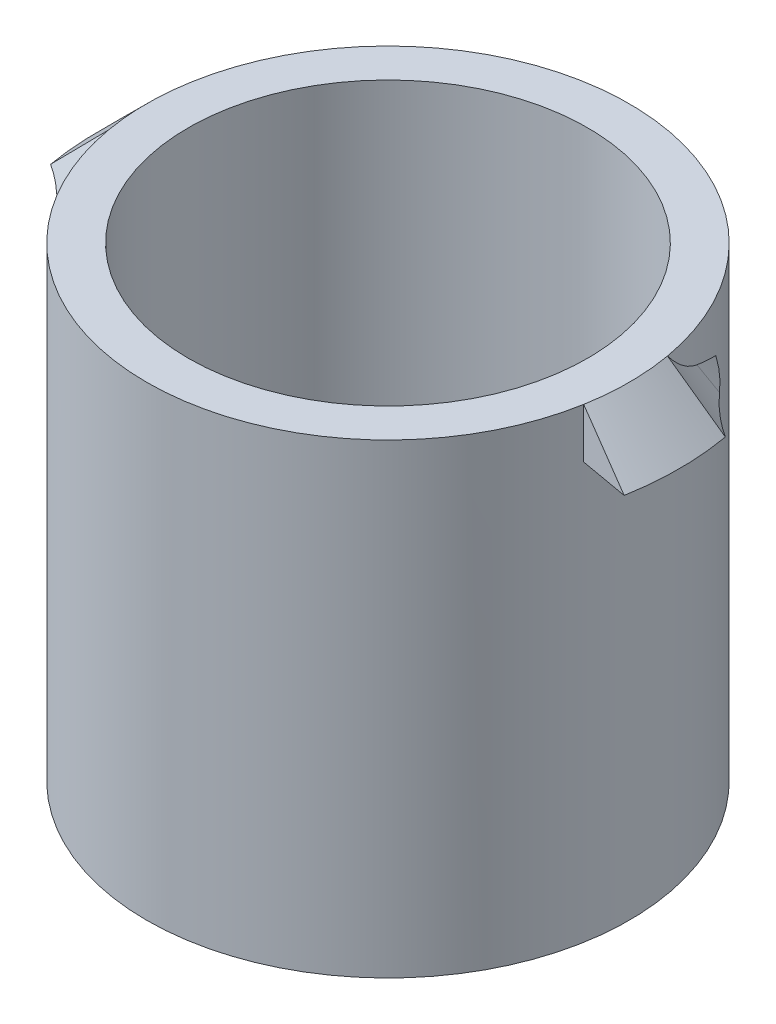
ISO-10303-21;
HEADER;
FILE_DESCRIPTION(('STEP AP214'),'2;1');
FILE_NAME('part.step','',(''),(''),'','','');
FILE_SCHEMA(('AUTOMOTIVE_DESIGN { 1 0 10303 214 1 1 1 1 }'));
ENDSEC;
DATA;
#1=APPLICATION_CONTEXT('core data for automotive mechanical design processes');
#2=APPLICATION_PROTOCOL_DEFINITION('international standard','automotive_design',2000,#1);
#3=PRODUCT_CONTEXT('',#1,'mechanical');
#4=PRODUCT('Part','Part','',(#3));
#5=PRODUCT_RELATED_PRODUCT_CATEGORY('part','',(#4));
#6=PRODUCT_DEFINITION_FORMATION('','',#4);
#7=PRODUCT_DEFINITION_CONTEXT('part definition',#1,'design');
#8=PRODUCT_DEFINITION('design','',#6,#7);
#9=PRODUCT_DEFINITION_SHAPE('','',#8);
#10=(LENGTH_UNIT() NAMED_UNIT(*) SI_UNIT(.MILLI.,.METRE.));
#11=(NAMED_UNIT(*) PLANE_ANGLE_UNIT() SI_UNIT($,.RADIAN.));
#12=(NAMED_UNIT(*) SI_UNIT($,.STERADIAN.) SOLID_ANGLE_UNIT());
#13=UNCERTAINTY_MEASURE_WITH_UNIT(LENGTH_MEASURE(1.E-05),#10,'distance_accuracy_value','');
#14=(GEOMETRIC_REPRESENTATION_CONTEXT(3) GLOBAL_UNCERTAINTY_ASSIGNED_CONTEXT((#13)) GLOBAL_UNIT_ASSIGNED_CONTEXT((#10,
#11,#12)) REPRESENTATION_CONTEXT('',''));
#15=CARTESIAN_POINT('',(0.,0.,0.));
#16=DIRECTION('',(0.,0.,1.));
#17=DIRECTION('',(1.,0.,0.));
#18=AXIS2_PLACEMENT_3D('',#15,#16,#17);
#19=CARTESIAN_POINT('',(0.,15.9574468085106,0.));
#20=DIRECTION('',(0.,1.,0.));
#21=DIRECTION('',(0.,0.,1.));
#22=AXIS2_PLACEMENT_3D('',#19,#20,#21);
#23=CYLINDRICAL_SURFACE('',#22,14.5);
#24=CARTESIAN_POINT('',(0.,12.5,0.));
#25=DIRECTION('',(0.,1.,0.));
#26=DIRECTION('',(0.,0.,1.));
#27=AXIS2_PLACEMENT_3D('',#24,#25,#26);
#28=CIRCLE('',#27,14.5);
#29=CARTESIAN_POINT('',(14.279712418677,12.5,-2.5178985761705));
#30=VERTEX_POINT('',#29);
#31=CARTESIAN_POINT('',(-14.279712418677,12.5,-2.5178985761705));
#32=VERTEX_POINT('',#31);
#33=EDGE_CURVE('E431',#30,#32,#28,.T.);
#34=ORIENTED_EDGE('',*,*,#33,.F.);
#35=CARTESIAN_POINT('',(18.1291565500211,8.59117198806576,-3.19665943725633));
#36=CARTESIAN_POINT('',(17.4407569855747,7.82584616983761,-4.3201406217331));
#37=CARTESIAN_POINT('',(16.9940332672841,7.35568776884984,-5.69898671094949));
#38=CARTESIAN_POINT('',(17.8477187224725,8.87695144774998,-3.14703435486752));
#39=CARTESIAN_POINT('',(17.1640434128771,8.10212081380435,-4.26337786019868));
#40=CARTESIAN_POINT('',(16.7196577880142,7.6209236133436,-5.63631734597751));
#41=CARTESIAN_POINT('',(17.5665902636226,9.16241676622455,-3.0974638225273));
#42=CARTESIAN_POINT('',(16.8878124566996,8.37723706924647,-4.20653752389778));
#43=CARTESIAN_POINT('',(16.4460136334214,7.88422804667438,-5.5736622971427));
#44=CARTESIAN_POINT('',(17.005404249799,9.73225997887913,-2.99851158709397));
#45=CARTESIAN_POINT('',(16.3368952675705,8.92414111391598,-4.09281642024974));
#46=CARTESIAN_POINT('',(15.90084427862,8.40565910452887,-5.44872084785809));
#47=CARTESIAN_POINT('',(16.7253462948507,10.016638279204,-2.94912981347454));
#48=CARTESIAN_POINT('',(16.0621983883405,9.19594031149953,-4.0359336233473));
#49=CARTESIAN_POINT('',(15.6293182372057,8.66378785601487,-5.38643430370933));
#50=CARTESIAN_POINT('',(16.3387183593955,10.4092305737636,-2.88095687695818));
#51=CARTESIAN_POINT('',(15.6833677163959,9.56922832823252,-3.95723475561948));
#52=CARTESIAN_POINT('',(15.2553661520049,9.01662550680332,-5.30070157746985));
#53=CARTESIAN_POINT('',(16.2315999430798,10.5180014643137,-2.86206901003095));
#54=CARTESIAN_POINT('',(15.5784506954577,9.67244521230164,-3.9354121663281));
#55=CARTESIAN_POINT('',(15.1518553783773,9.11400703391215,-5.27697588824107));
#56=CARTESIAN_POINT('',(16.0175590564884,10.7353442765902,-2.82432782675013));
#57=CARTESIAN_POINT('',(15.3688968891475,9.87823810345469,-3.89177208357924));
#58=CARTESIAN_POINT('',(14.9452278276463,9.3077754630276,-5.22964458391971));
#59=CARTESIAN_POINT('',(15.910636620466,10.8439161635349,-2.80547451643631));
#60=CARTESIAN_POINT('',(15.264259270196,9.98081486825436,-3.86995440765565));
#61=CARTESIAN_POINT('',(14.8421111165284,9.40416220268989,-5.20603898873491));
#62=CARTESIAN_POINT('',(15.8038326794683,10.9523677274782,-2.78664209999243));
#63=CARTESIAN_POINT('',(15.1597847322079,10.0830312774162,-3.84814445438687));
#64=CARTESIAN_POINT('',(14.7392177991944,9.49999999395313,-5.18250904006833));
#65=CARTESIAN_POINT('',(15.6314897905654,11.1273692832396,-2.75625339874559));
#66=CARTESIAN_POINT('',(14.9911975400007,10.2479705980724,-3.81295103101248));
#67=CARTESIAN_POINT('',(14.573184600078,9.65464226771677,-5.14454412769313));
#68=CARTESIAN_POINT('',(15.4594540896592,11.3020589121342,-2.72591886303073));
#69=CARTESIAN_POINT('',(14.8230297814695,10.4119843450707,-3.77777558983734));
#70=CARTESIAN_POINT('',(14.4077324469624,9.80786691989288,-5.10676866487617));
#71=CARTESIAN_POINT('',(15.116240053358,11.6505675781671,-2.66540096827298));
#72=CARTESIAN_POINT('',(14.4877897004126,10.7377178792464,-3.70752397279333));
#73=CARTESIAN_POINT('',(14.0782686435995,10.1109285332955,-5.03178743055511));
#74=CARTESIAN_POINT('',(14.9450612560556,11.8243870843386,-2.63521752778334));
#75=CARTESIAN_POINT('',(14.3207116154969,10.8994439572249,-3.67244666268691));
#76=CARTESIAN_POINT('',(13.9142561706036,10.260767518492,-4.99458132322486));
#77=CARTESIAN_POINT('',(14.5390117786154,12.2367005294736,-2.56362004940808));
#78=CARTESIAN_POINT('',(13.9247002715405,11.2810744096598,-3.58916182861151));
#79=CARTESIAN_POINT('',(13.5259946396655,10.6126638420458,-4.90694430149904));
#80=CARTESIAN_POINT('',(14.3045405957042,12.474788808322,-2.52227645366219));
#81=CARTESIAN_POINT('',(13.6962694527892,11.49985081723,-3.54100529869052));
#82=CARTESIAN_POINT('',(13.3024267410814,10.8130349641296,-4.85683426769212));
#83=CARTESIAN_POINT('',(13.8375676610241,12.9489655532265,-2.43993652601749));
#84=CARTESIAN_POINT('',(13.2418162087176,11.9316685298048,-3.44501338978302));
#85=CARTESIAN_POINT('',(12.8584361890877,11.2053501817832,-4.75856535871571));
#86=CARTESIAN_POINT('',(13.6050677497857,13.185052150359,-2.39894051865384));
#87=CARTESIAN_POINT('',(13.0157742255461,12.1447247878936,-3.39717368211567));
#88=CARTESIAN_POINT('',(12.6380163663595,11.3972869803191,-4.71040817574885));
#89=CARTESIAN_POINT('',(13.373894220335,13.4197919041269,-2.35817838818606));
#90=CARTESIAN_POINT('',(12.7912758197526,12.3542360568956,-3.34958871125807));
#91=CARTESIAN_POINT('',(12.4194951799688,11.5841818455645,-4.663568756941));
#92=(BOUNDED_SURFACE() B_SPLINE_SURFACE(3,2,((#35,#36,#37),(#38,#39,#40),(#41,#42,#43),(#44,#45,
#46),(#47,#48,#49),(#50,#51,#52),(#53,#54,#55),(#56,#57,#58),(#59,#60,#61),(#62,#63,#64),(#65,
#66,#67),(#68,#69,#70),(#71,#72,#73),(#74,#75,#76),(#77,#78,#79),(#80,#81,#82),(#83,#84,#85),
(#86,#87,#88),(#89,#90,#91)),.UNSPECIFIED.,.F.,.F.,.F.) B_SPLINE_SURFACE_WITH_KNOTS((4,2,2,2,3,
2,2,2,4),(3,3),(0.,1.22308796174281,2.44566254004529,2.91477154809211,3.38395593886468,
4.14105476039857,4.8976883226624,5.94051711722712,6.98423104275938),(0.,1.),
.UNSPECIFIED.) GEOMETRIC_REPRESENTATION_ITEM() RATIONAL_B_SPLINE_SURFACE(((1.,0.988589186786387,
1.),(1.,0.988627638307937,1.),(1.,0.988660409305402,1.),(1.,0.988708009242246,1.),(1.,
0.988722845706918,1.),(1.,0.988726438614572,1.),(1.,0.988725632858965,1.),(1.,0.988719855325513,
1.),(1.,0.988714882878236,1.),(1.,0.988707546147952,1.),(1.,0.988695622018106,1.),(1.,
0.988677700783008,1.),(1.,0.988626524691875,1.),(1.,0.988593279265565,1.),(1.,0.98849200121005,
1.),(1.,0.988415566864297,1.),(1.,0.988214128703858,1.),(1.,0.988089083719501,1.),(1.,
0.987933238422901,1.))) REPRESENTATION_ITEM('') SURFACE());
#93=CARTESIAN_POINT('',(14.279712418677,12.5,-2.5178985761705));
#94=CARTESIAN_POINT('',(14.2577653690716,12.340531563629,-2.64226033705779));
#95=CARTESIAN_POINT('',(14.2331889683553,12.1856097889129,-2.77223897064588));
#96=CARTESIAN_POINT('',(14.1776524967388,11.8865293051149,-3.04360905639239));
#97=CARTESIAN_POINT('',(14.1466740368025,11.742403267087,-3.18503265447744));
#98=CARTESIAN_POINT('',(14.0782333561083,11.4711416042713,-3.47489384314671));
#99=CARTESIAN_POINT('',(14.0409624534521,11.3436595565626,-3.62305027029018));
#100=CARTESIAN_POINT('',(13.9584976606385,11.1038120470079,-3.92878615841227));
#101=CARTESIAN_POINT('',(13.9133161642593,10.9914234175035,-4.08635062872344));
#102=CARTESIAN_POINT('',(13.8300725424804,10.8171087432795,-4.3580159932998));
#103=CARTESIAN_POINT('',(13.7943629854591,10.7505473880125,-4.46987962041777));
#104=CARTESIAN_POINT('',(13.7183895920387,10.6254368549581,-4.69791441534058));
#105=CARTESIAN_POINT('',(13.678087851805,10.5669647260218,-4.81411517711495));
#106=CARTESIAN_POINT('',(13.6355514508136,10.5131646992949,-4.93170727357322));
#107=B_SPLINE_CURVE_WITH_KNOTS('',3,(#93,#94,#95,#96,#97,#98,#99,#100,#101,#102,#103,#104,#105,
#106),.UNSPECIFIED.,.F.,.F.,(4,2,2,2,2,2,4),(0.,0.610335053411883,1.22244820350455,
1.81851049656598,2.41364714282786,2.81822592662251,3.22642604798356),.UNSPECIFIED.);
#108=CARTESIAN_POINT('',(13.6355514508136,10.5131646992949,-4.93170727357322));
#109=VERTEX_POINT('',#108);
#110=EDGE_CURVE('E60',#30,#109,#107,.T.);
#111=ORIENTED_EDGE('',*,*,#110,.T.);
#112=CARTESIAN_POINT('',(12.7018678108422,9.5,-6.99375107620292));
#113=CARTESIAN_POINT('',(12.7798918434986,9.57437639739467,-6.85204294006238));
#114=CARTESIAN_POINT('',(12.8555950901162,9.64851251113147,-6.70894262610205));
#115=CARTESIAN_POINT('',(13.00229253388,9.79614059879349,-6.4200195425192));
#116=CARTESIAN_POINT('',(13.0732866740729,9.86963256491889,-6.27419673999743));
#117=CARTESIAN_POINT('',(13.279192429628,10.0889910883362,-5.83254754179518));
#118=CARTESIAN_POINT('',(13.4069237440701,10.2336412198049,-5.53272840954804));
#119=CARTESIAN_POINT('',(13.6425088350883,10.5185385064637,-4.92328407863446));
#120=CARTESIAN_POINT('',(13.7503606275717,10.6587852210093,-4.61365790477787));
#121=CARTESIAN_POINT('',(13.8966727631589,10.8642117380643,-4.14240509184159));
#122=CARTESIAN_POINT('',(13.9428589080589,10.9318514990133,-3.98421453506626));
#123=CARTESIAN_POINT('',(14.0300022012646,11.0651828181942,-3.66555940662737));
#124=CARTESIAN_POINT('',(14.0709586704734,11.1308741225616,-3.50509454263437));
#125=CARTESIAN_POINT('',(14.1726137213676,11.3022272185183,-3.0761252625409));
#126=CARTESIAN_POINT('',(14.2286714538574,11.4058856741731,-2.80570013661054));
#127=CARTESIAN_POINT('',(14.3256094209771,11.6051459311406,-2.25918325012001));
#128=CARTESIAN_POINT('',(14.3664896918479,11.7007477516907,-1.98309150309233));
#129=CARTESIAN_POINT('',(14.4160175900219,11.8370839050823,-1.56469417320338));
#130=CARTESIAN_POINT('',(14.4305783533859,11.8814314251823,-1.42423909427642));
#131=CARTESIAN_POINT('',(14.455638152361,11.9675553940351,-1.14217786005569));
#132=CARTESIAN_POINT('',(14.4661372186287,12.0093318621915,-1.00057171345812));
#133=CARTESIAN_POINT('',(14.482997589122,12.0902239002845,-0.716284099925345));
#134=CARTESIAN_POINT('',(14.4893569282564,12.129338198636,-0.573602154778654));
#135=CARTESIAN_POINT('',(14.4978590369467,12.2048617261975,-0.28739179971808));
#136=CARTESIAN_POINT('',(14.5000015953816,12.2412708198785,-0.143863347783051));
#137=CARTESIAN_POINT('',(14.5,12.2763141276567,0.));
#138=B_SPLINE_CURVE_WITH_KNOTS('',3,(#112,#113,#114,#115,#116,#117,#118,#119,#120,#121,#122,
#123,#124,#125,#126,#127,#128,#129,#130,#131,#132,#133,#134,#135,#136,#137),.UNSPECIFIED.,.F.,
.F.,(4,2,2,2,2,2,2,2,2,2,2,2,4),(0.,0.534101285880762,1.06820903016045,2.13713267175302,
3.20616294048145,3.74048430498869,4.27487498313207,5.15930075306908,6.04372441114665,
6.48767905723223,6.93163035239745,7.37579223387566,7.81997635259694),.UNSPECIFIED.);
#139=CARTESIAN_POINT('',(12.701230867694,9.5,-6.99490763979816));
#140=VERTEX_POINT('',#139);
#141=EDGE_CURVE('E107',#140,#109,#138,.T.);
#142=ORIENTED_EDGE('',*,*,#141,.F.);
#143=CARTESIAN_POINT('',(0.,9.5,0.));
#144=DIRECTION('',(0.,-1.,0.));
#145=DIRECTION('',(0.,0.,1.));
#146=AXIS2_PLACEMENT_3D('',#143,#144,#145);
#147=CIRCLE('',#146,14.5);
#148=CARTESIAN_POINT('',(14.279712418677,9.5,2.5178985761705));
#149=VERTEX_POINT('',#148);
#150=EDGE_CURVE('E101',#140,#149,#147,.T.);
#151=ORIENTED_EDGE('',*,*,#150,.T.);
#152=DIRECTION('',(0.,1.,0.));
#153=VECTOR('',#152,1.);
#154=CARTESIAN_POINT('',(14.279712418677,0.,2.5178985761705));
#155=LINE('',#154,#153);
#156=CARTESIAN_POINT('',(14.279712418677,12.5,2.5178985761705));
#157=VERTEX_POINT('',#156);
#158=EDGE_CURVE('E105',#149,#157,#155,.T.);
#159=ORIENTED_EDGE('',*,*,#158,.T.);
#160=CARTESIAN_POINT('',(-14.279712418677,12.5,2.5178985761705));
#161=VERTEX_POINT('',#160);
#162=EDGE_CURVE('E433',#161,#157,#28,.T.);
#163=ORIENTED_EDGE('',*,*,#162,.F.);
#164=CARTESIAN_POINT('',(-18.1291497187687,8.5911789247013,3.19665823272221));
#165=CARTESIAN_POINT('',(-17.4407502686279,7.82585287661343,4.32013924382053));
#166=CARTESIAN_POINT('',(-16.9940266073607,7.35569420763594,5.69898518937925));
#167=CARTESIAN_POINT('',(-17.8477113180827,8.87695896636438,3.14703304927383));
#168=CARTESIAN_POINT('',(-17.1640361356874,8.10212806818236,4.26337636462024));
#169=CARTESIAN_POINT('',(-16.7196505764197,7.62093056442041,5.63631569664085));
#170=CARTESIAN_POINT('',(-17.5665822878936,9.16242486499207,3.09746241619108));
#171=CARTESIAN_POINT('',(-16.8878046220464,8.37724486472027,4.20653591035197));
#172=CARTESIAN_POINT('',(-16.4460058744271,7.88423549931669,5.57366052042005));
#173=CARTESIAN_POINT('',(-17.0053951386971,9.73226923053445,2.99850998056088));
#174=CARTESIAN_POINT('',(-16.3368863280721,8.9241499700652,4.09281457129179));
#175=CARTESIAN_POINT('',(-15.9008354385061,8.40566752772569,5.44871882069888));
#176=CARTESIAN_POINT('',(-16.7253366197118,10.0166481035975,2.94912810748651));
#177=CARTESIAN_POINT('',(-16.0621889013603,9.19594968733291,4.03593165692461));
#178=CARTESIAN_POINT('',(-15.6293088633653,8.66379674821708,5.38643215349757));
#179=CARTESIAN_POINT('',(-16.3387098362393,10.4092392284032,2.88095537409579));
#180=CARTESIAN_POINT('',(-15.6833593677602,9.56923654418665,3.95723301955705));
#181=CARTESIAN_POINT('',(-15.255357914377,9.01663326114808,5.30069968927733));
#182=CARTESIAN_POINT('',(-16.2315931281887,10.5180083843354,2.86206780838179));
#183=CARTESIAN_POINT('',(-15.5784440220504,9.67245177172701,3.93541077744913));
#184=CARTESIAN_POINT('',(-15.1518487962716,9.11401321628149,5.27697438009305));
#185=CARTESIAN_POINT('',(-16.0175556523153,10.7353477332781,2.82432722650256));
#186=CARTESIAN_POINT('',(-15.368893557729,9.87824136928026,3.89177138892986));
#187=CARTESIAN_POINT('',(-14.945224544633,9.30777853181516,5.22964383231606));
#188=CARTESIAN_POINT('',(-15.9106349187442,10.8439178915086,2.80547421637684));
#189=CARTESIAN_POINT('',(-15.2642576055763,9.98081649697402,3.86995406006077));
#190=CARTESIAN_POINT('',(-14.8421094770822,9.40416372987877,5.20603861363022));
#191=CARTESIAN_POINT('',(-15.8038326764726,10.9523677305202,2.7866420994642));
#192=CARTESIAN_POINT('',(-15.1597847292191,10.0830312804595,3.84814445352863));
#193=CARTESIAN_POINT('',(-14.7392177962169,9.4999999970197,5.18250903895706));
#194=CARTESIAN_POINT('',(-15.6314875076459,11.1273716013767,2.7562529962053));
#195=CARTESIAN_POINT('',(-14.9911953067799,10.2479727827704,3.81295056476283));
#196=CARTESIAN_POINT('',(-14.5731824006293,9.6546443160147,5.14454362486267));
#197=CARTESIAN_POINT('',(-15.459449534655,11.3020635374066,2.72591805986061));
#198=CARTESIAN_POINT('',(-14.8230253287952,10.4119886876362,3.77777465847189));
#199=CARTESIAN_POINT('',(-14.4077280662409,9.80787097669929,5.10676766477309));
#200=CARTESIAN_POINT('',(-15.1162309796572,11.6505767918444,2.66539936833471));
#201=CARTESIAN_POINT('',(-14.4877808407312,10.7377264714852,3.70752211448296));
#202=CARTESIAN_POINT('',(-14.0782599416379,10.1109365107056,5.0317854532753));
#203=CARTESIAN_POINT('',(-14.9450499357192,11.8243985793093,2.63521553170262));
#204=CARTESIAN_POINT('',(-14.3207005680128,10.8994546415459,3.67244434249869));
#205=CARTESIAN_POINT('',(-13.9142453286335,10.260777408099,4.99457886602343));
#206=CARTESIAN_POINT('',(-14.5389982583595,12.2367142583013,2.56361766542217));
#207=CARTESIAN_POINT('',(-13.9246870950308,11.2810870550038,3.58915905308382));
#208=CARTESIAN_POINT('',(-13.5259817355866,10.6126754501035,4.90694140291718));
#209=CARTESIAN_POINT('',(-14.3045271123684,12.4748024996599,2.52227407618631));
#210=CARTESIAN_POINT('',(-13.6962563217759,11.4998633605593,3.54100252867456));
#211=CARTESIAN_POINT('',(-13.3024138971274,10.8130464219053,4.85683140061454));
#212=CARTESIAN_POINT('',(-13.8375542592976,12.9489791616963,2.43993416293151));
#213=CARTESIAN_POINT('',(-13.2418031752644,11.9316808485006,3.4450106331212));
#214=CARTESIAN_POINT('',(-12.8584234719508,11.2053613112803,4.75856256739329));
#215=CARTESIAN_POINT('',(-13.6050543927722,13.1850657134261,2.39893816345196));
#216=CARTESIAN_POINT('',(-13.0157612440697,12.1447369839996,3.39717093327682));
#217=CARTESIAN_POINT('',(-12.6380037159464,11.3972979317317,4.71040542870312));
#218=CARTESIAN_POINT('',(-13.3738809134153,13.4198054163273,2.35817604181709));
#219=CARTESIAN_POINT('',(-12.7912628945763,12.3542481176025,3.34958597176665));
#220=CARTESIAN_POINT('',(-12.4194825997311,11.5841926026136,4.6635660622337));
#221=(BOUNDED_SURFACE() B_SPLINE_SURFACE(3,2,((#164,#165,#166),(#167,#168,#169),(#170,#171,
#172),(#173,#174,#175),(#176,#177,#178),(#179,#180,#181),(#182,#183,#184),(#185,#186,#187),
(#188,#189,#190),(#191,#192,#193),(#194,#195,#196),(#197,#198,#199),(#200,#201,#202),(#203,#204,
#205),(#206,#207,#208),(#209,#210,#211),(#212,#213,#214),(#215,#216,#217),(#218,#219,#220)),
.UNSPECIFIED.,.F.,.F.,.F.) B_SPLINE_SURFACE_WITH_KNOTS((4,2,2,2,3,2,2,2,4),(3,3),(0.,
1.22309047794446,2.4456675707035,2.91476911909797,3.38394604776447,4.14105488539585,
4.89769844740241,5.94052724135779,6.98424117396869),(0.,1.),
.UNSPECIFIED.) GEOMETRIC_REPRESENTATION_ITEM() RATIONAL_B_SPLINE_SURFACE(((1.,0.988589187728949,
1.),(1.,0.988627639221839,1.),(1.,0.988660410156714,1.),(1.,0.988708009833657,1.),(1.,
0.988722846101084,1.),(1.,0.988726438578556,1.),(1.,0.988725632740626,1.),(1.,0.988719855167744,
1.),(1.,0.988714882763393,1.),(1.,0.988707546151393,1.),(1.,0.988695621856175,1.),(1.,
0.988677700306075,1.),(1.,0.988626523135708,1.),(1.,0.988593276945648,1.),(1.,0.988491997136989,
1.),(1.,0.988415562001316,1.),(1.,0.988214121989115,1.),(1.,0.98808907594233,1.),(1.,
0.987933229412204,1.))) REPRESENTATION_ITEM('') SURFACE());
#222=CARTESIAN_POINT('',(-14.279712418677,12.5,2.5178985761705));
#223=CARTESIAN_POINT('',(-14.2577653690717,12.3405315635698,2.64226033706174));
#224=CARTESIAN_POINT('',(-14.2331889683563,12.1856097887964,2.77223897064293));
#225=CARTESIAN_POINT('',(-14.1776524967528,11.8865293049158,3.04360905632256));
#226=CARTESIAN_POINT('',(-14.1466740368308,11.7424032668591,3.18503265434409));
#227=CARTESIAN_POINT('',(-14.0782333561717,11.4711416039356,3.47489384289115));
#228=CARTESIAN_POINT('',(-14.0409624535359,11.3436595561498,3.62305026997665));
#229=CARTESIAN_POINT('',(-13.9584976606884,11.1038120467944,3.92878615823006));
#230=CARTESIAN_POINT('',(-13.913316164254,10.9914234175678,4.08635062873146));
#231=CARTESIAN_POINT('',(-13.8300725424856,10.8171087432393,4.358015993289));
#232=CARTESIAN_POINT('',(-13.7943629854977,10.7505473877736,4.46987962030436));
#233=CARTESIAN_POINT('',(-13.7183895921087,10.6254368545372,4.69791441512818));
#234=CARTESIAN_POINT('',(-13.6780878518726,10.5669647256194,4.81411517690712));
#235=CARTESIAN_POINT('',(-13.6355514508136,10.5131646992949,4.93170727357322));
#236=B_SPLINE_CURVE_WITH_KNOTS('',3,(#222,#223,#224,#225,#226,#227,#228,#229,#230,#231,#232,
#233,#234,#235),.UNSPECIFIED.,.F.,.F.,(4,2,2,2,2,2,4),(0.,0.610335053539954,1.22244820356657,
1.81851049659689,2.41364714290705,2.81822592671485,3.22642604808947),.UNSPECIFIED.);
#237=CARTESIAN_POINT('',(-13.6355514508136,10.5131646992949,4.93170727357322));
#238=VERTEX_POINT('',#237);
#239=EDGE_CURVE('E288',#161,#238,#236,.T.);
#240=ORIENTED_EDGE('',*,*,#239,.T.);
#241=CARTESIAN_POINT('',(-12.7018678108422,9.5,6.99375107620292));
#242=CARTESIAN_POINT('',(-12.7798918434986,9.57437639739467,6.85204294006238));
#243=CARTESIAN_POINT('',(-12.8555950901162,9.64851251113147,6.70894262610205));
#244=CARTESIAN_POINT('',(-13.00229253388,9.79614059879349,6.4200195425192));
#245=CARTESIAN_POINT('',(-13.0732866740729,9.86963256491889,6.27419673999743));
#246=CARTESIAN_POINT('',(-13.279192429628,10.0889910883362,5.83254754179518));
#247=CARTESIAN_POINT('',(-13.4069237440701,10.2336412198049,5.53272840954804));
#248=CARTESIAN_POINT('',(-13.6425088350883,10.5185385064637,4.92328407863446));
#249=CARTESIAN_POINT('',(-13.7503606275717,10.6587852210093,4.61365790477787));
#250=CARTESIAN_POINT('',(-13.8966727631589,10.8642117380643,4.14240509184159));
#251=CARTESIAN_POINT('',(-13.9428589080589,10.9318514990133,3.98421453506626));
#252=CARTESIAN_POINT('',(-14.0300022012646,11.0651828181942,3.66555940662737));
#253=CARTESIAN_POINT('',(-14.0709586704734,11.1308741225616,3.50509454263437));
#254=CARTESIAN_POINT('',(-14.1726137213676,11.3022272185183,3.0761252625409));
#255=CARTESIAN_POINT('',(-14.2286714538574,11.4058856741731,2.80570013661054));
#256=CARTESIAN_POINT('',(-14.3256094209771,11.6051459311406,2.25918325012001));
#257=CARTESIAN_POINT('',(-14.3664896918479,11.7007477516907,1.98309150309233));
#258=CARTESIAN_POINT('',(-14.4160175900219,11.8370839050823,1.56469417320338));
#259=CARTESIAN_POINT('',(-14.4305783533859,11.8814314251823,1.42423909427642));
#260=CARTESIAN_POINT('',(-14.455638152361,11.9675553940351,1.14217786005569));
#261=CARTESIAN_POINT('',(-14.4661372186287,12.0093318621915,1.00057171345812));
#262=CARTESIAN_POINT('',(-14.482997589122,12.0902239002845,0.716284099925345));
#263=CARTESIAN_POINT('',(-14.4893569282564,12.129338198636,0.573602154778654));
#264=CARTESIAN_POINT('',(-14.4978590369467,12.2048617261975,0.28739179971808));
#265=CARTESIAN_POINT('',(-14.5000015953816,12.2412708198785,0.143863347783051));
#266=CARTESIAN_POINT('',(-14.5,12.2763141276567,0.));
#267=B_SPLINE_CURVE_WITH_KNOTS('',3,(#241,#242,#243,#244,#245,#246,#247,#248,#249,#250,#251,
#252,#253,#254,#255,#256,#257,#258,#259,#260,#261,#262,#263,#264,#265,#266),.UNSPECIFIED.,.F.,
.F.,(4,2,2,2,2,2,2,2,2,2,2,2,4),(0.,0.534101285880762,1.06820903016045,2.13713267175302,
3.20616294048145,3.74048430498869,4.27487498313207,5.15930075306908,6.04372441114665,
6.48767905723223,6.93163035239745,7.37579223387566,7.81997635259694),.UNSPECIFIED.);
#268=CARTESIAN_POINT('',(-12.701230867694,9.5,6.99490763979816));
#269=VERTEX_POINT('',#268);
#270=EDGE_CURVE('E124',#269,#238,#267,.T.);
#271=ORIENTED_EDGE('',*,*,#270,.F.);
#272=CARTESIAN_POINT('',(0.,9.5,0.));
#273=DIRECTION('',(0.,1.,0.));
#274=DIRECTION('',(0.,0.,1.));
#275=AXIS2_PLACEMENT_3D('',#272,#273,#274);
#276=CIRCLE('',#275,14.5);
#277=CARTESIAN_POINT('',(-14.279712418677,9.5,-2.5178985761705));
#278=VERTEX_POINT('',#277);
#279=EDGE_CURVE('E448',#278,#269,#276,.T.);
#280=ORIENTED_EDGE('',*,*,#279,.F.);
#281=DIRECTION('',(0.,1.,0.));
#282=VECTOR('',#281,1.);
#283=CARTESIAN_POINT('',(-14.279712418677,0.,-2.5178985761705));
#284=LINE('',#283,#282);
#285=EDGE_CURVE('E475',#278,#32,#284,.T.);
#286=ORIENTED_EDGE('',*,*,#285,.T.);
#287=EDGE_LOOP('',(#34,#111,#142,#151,#159,#163,#240,#271,#280,#286));
#288=FACE_BOUND('',#287,.T.);
#289=CARTESIAN_POINT('',(0.,-15.5,0.));
#290=DIRECTION('',(0.,1.,0.));
#291=DIRECTION('',(0.,0.,1.));
#292=AXIS2_PLACEMENT_3D('',#289,#290,#291);
#293=CIRCLE('',#292,14.5);
#294=CARTESIAN_POINT('',(0.,-15.5,14.5));
#295=VERTEX_POINT('',#294);
#296=EDGE_CURVE('E439',#295,#295,#293,.T.);
#297=ORIENTED_EDGE('',*,*,#296,.T.);
#298=EDGE_LOOP('',(#297));
#299=FACE_BOUND('',#298,.T.);
#300=ADVANCED_FACE('F35',(#288,#299),#23,.T.);
#301=CARTESIAN_POINT('',(0.,15.9574468085106,0.));
#302=DIRECTION('',(0.,1.,0.));
#303=DIRECTION('',(0.,0.,1.));
#304=AXIS2_PLACEMENT_3D('',#301,#302,#303);
#305=CYLINDRICAL_SURFACE('',#304,12.);
#306=CARTESIAN_POINT('',(0.,12.5,0.));
#307=DIRECTION('',(0.,1.,0.));
#308=DIRECTION('',(0.,0.,1.));
#309=AXIS2_PLACEMENT_3D('',#306,#307,#308);
#310=CIRCLE('',#309,12.);
#311=CARTESIAN_POINT('',(0.,12.5,12.));
#312=VERTEX_POINT('',#311);
#313=EDGE_CURVE('E438',#312,#312,#310,.T.);
#314=ORIENTED_EDGE('',*,*,#313,.T.);
#315=EDGE_LOOP('',(#314));
#316=FACE_BOUND('',#315,.T.);
#317=CARTESIAN_POINT('',(0.,-12.5,0.));
#318=DIRECTION('',(0.,1.,0.));
#319=DIRECTION('',(0.,0.,1.));
#320=AXIS2_PLACEMENT_3D('',#317,#318,#319);
#321=CIRCLE('',#320,12.);
#322=CARTESIAN_POINT('',(0.,-12.5,12.));
#323=VERTEX_POINT('',#322);
#324=EDGE_CURVE('E466',#323,#323,#321,.T.);
#325=ORIENTED_EDGE('',*,*,#324,.F.);
#326=EDGE_LOOP('',(#325));
#327=FACE_BOUND('',#326,.T.);
#328=ADVANCED_FACE('F295',(#316,#327),#305,.F.);
#329=CARTESIAN_POINT('',(0.,12.5,0.));
#330=DIRECTION('',(0.,-1.,0.));
#331=DIRECTION('',(0.,0.,-1.));
#332=AXIS2_PLACEMENT_3D('',#329,#330,#331);
#333=PLANE('',#332);
#334=ORIENTED_EDGE('',*,*,#313,.F.);
#335=EDGE_LOOP('',(#334));
#336=FACE_BOUND('',#335,.T.);
#337=EDGE_CURVE('E435',#32,#161,#28,.T.);
#338=ORIENTED_EDGE('',*,*,#337,.T.);
#339=ORIENTED_EDGE('',*,*,#162,.T.);
#340=CARTESIAN_POINT('',(0.,12.5,0.));
#341=DIRECTION('',(0.,-1.,0.));
#342=DIRECTION('',(0.,0.,1.));
#343=AXIS2_PLACEMENT_3D('',#340,#341,#342);
#344=CIRCLE('',#343,14.5);
#345=EDGE_CURVE('E111',#30,#157,#344,.T.);
#346=ORIENTED_EDGE('',*,*,#345,.F.);
#347=ORIENTED_EDGE('',*,*,#33,.T.);
#348=EDGE_LOOP('',(#338,#339,#346,#347));
#349=FACE_BOUND('',#348,.T.);
#350=ADVANCED_FACE('F297',(#336,#349),#333,.F.);
#351=CARTESIAN_POINT('',(0.,-15.5,0.));
#352=DIRECTION('',(0.,-1.,0.));
#353=DIRECTION('',(0.,0.,-1.));
#354=AXIS2_PLACEMENT_3D('',#351,#352,#353);
#355=PLANE('',#354);
#356=ORIENTED_EDGE('',*,*,#296,.F.);
#357=EDGE_LOOP('',(#356));
#358=FACE_BOUND('',#357,.T.);
#359=ADVANCED_FACE('F300',(#358),#355,.T.);
#360=CARTESIAN_POINT('',(0.,-12.5,0.));
#361=DIRECTION('',(0.,-1.,0.));
#362=DIRECTION('',(0.,0.,-1.));
#363=AXIS2_PLACEMENT_3D('',#360,#361,#362);
#364=PLANE('',#363);
#365=ORIENTED_EDGE('',*,*,#324,.T.);
#366=EDGE_LOOP('',(#365));
#367=FACE_BOUND('',#366,.T.);
#368=ADVANCED_FACE('F305',(#367),#364,.F.);
#369=CARTESIAN_POINT('',(0.,9.5,0.));
#370=DIRECTION('',(0.,-1.,0.));
#371=DIRECTION('',(0.,0.,-1.));
#372=AXIS2_PLACEMENT_3D('',#369,#370,#371);
#373=PLANE('',#372);
#374=ORIENTED_EDGE('',*,*,#279,.T.);
#375=CARTESIAN_POINT('',(-17.2341356777136,9.5,0.));
#376=CARTESIAN_POINT('',(-16.7813298693871,9.50000000002716,2.50908422102215));
#377=CARTESIAN_POINT('',(-15.5207610984171,9.5,4.59235862045668));
#378=CARTESIAN_POINT('',(-12.0762080006393,9.5,7.66840963937823));
#379=CARTESIAN_POINT('',(-9.89082186508382,9.5,8.65923799073873));
#380=CARTESIAN_POINT('',(-7.59464696490958,9.5,8.97044749967211));
#381=B_SPLINE_CURVE_WITH_KNOTS('',3,(#375,#376,#377,#378,#379,#380),.UNSPECIFIED.,.F.,.F.,(4,2,
4),(0.,0.5,1.),.UNSPECIFIED.);
#382=CARTESIAN_POINT('',(-14.7394715027472,9.50000000000122,5.18273224127646));
#383=VERTEX_POINT('',#382);
#384=EDGE_CURVE('E127',#383,#269,#381,.T.);
#385=ORIENTED_EDGE('',*,*,#384,.F.);
#386=CARTESIAN_POINT('',(-14.7392177964835,9.5,5.18250903427981));
#387=CARTESIAN_POINT('',(-14.9211528411118,9.5,4.97548488973549));
#388=CARTESIAN_POINT('',(-15.1110240606979,9.5,4.77559799151723));
#389=CARTESIAN_POINT('',(-15.5037383141033,9.5,4.39077144844159));
#390=CARTESIAN_POINT('',(-15.706520475084,9.5,4.20576979656942));
#391=CARTESIAN_POINT('',(-16.1238001081254,9.5,3.8495612506587));
#392=CARTESIAN_POINT('',(-16.3382978047051,9.5,3.67835462114657));
#393=CARTESIAN_POINT('',(-16.7784307209793,9.5,3.34876826149271));
#394=CARTESIAN_POINT('',(-17.0041110443624,9.5,3.1904486739916));
#395=CARTESIAN_POINT('',(-17.2341356777136,9.5,3.03884310917128));
#396=B_SPLINE_CURVE_WITH_KNOTS('',3,(#386,#387,#388,#389,#390,#391,#392,#393,#394,#395),
.UNSPECIFIED.,.F.,.F.,(4,2,2,2,4),(0.,0.826439350680417,1.64923554251458,2.47204750812257,
3.29850221107031),.UNSPECIFIED.);
#397=CARTESIAN_POINT('',(-17.2341356777136,9.5,3.03884310917129));
#398=VERTEX_POINT('',#397);
#399=EDGE_CURVE('E159',#383,#398,#396,.T.);
#400=ORIENTED_EDGE('',*,*,#399,.T.);
#401=CARTESIAN_POINT('',(0.,9.5,0.));
#402=DIRECTION('',(0.,1.,0.));
#403=DIRECTION('',(0.,0.,1.));
#404=AXIS2_PLACEMENT_3D('',#401,#402,#403);
#405=CIRCLE('',#404,17.5);
#406=CARTESIAN_POINT('',(-17.2341356777136,9.5,-3.03884310917129));
#407=VERTEX_POINT('',#406);
#408=EDGE_CURVE('E467',#407,#398,#405,.T.);
#409=ORIENTED_EDGE('',*,*,#408,.F.);
#410=DIRECTION('',(0.984807753012208,0.,0.173648177666931));
#411=VECTOR('',#410,1.);
#412=CARTESIAN_POINT('',(0.,9.50000000000001,0.));
#413=LINE('',#412,#411);
#414=EDGE_CURVE('E464',#407,#278,#413,.T.);
#415=ORIENTED_EDGE('',*,*,#414,.T.);
#416=EDGE_LOOP('',(#374,#385,#400,#409,#415));
#417=FACE_BOUND('',#416,.T.);
#418=ADVANCED_FACE('F344',(#417),#373,.T.);
#419=CARTESIAN_POINT('',(0.,12.5,0.));
#420=DIRECTION('',(0.,-1.,0.));
#421=DIRECTION('',(0.,0.,-1.));
#422=AXIS2_PLACEMENT_3D('',#419,#420,#421);
#423=CONICAL_SURFACE('',#422,14.5,0.785398163397449);
#424=DIRECTION('',(-0.696364240320019,-0.707106781186548,-0.122787803968973));
#425=VECTOR('',#424,1.);
#426=CARTESIAN_POINT('',(-13.2949046656648,13.5,-2.34425039850356));
#427=LINE('',#426,#425);
#428=EDGE_CURVE('E473',#32,#407,#427,.T.);
#429=ORIENTED_EDGE('',*,*,#428,.T.);
#430=ORIENTED_EDGE('',*,*,#408,.T.);
#431=DIRECTION('',(-0.696364240320019,-0.707106781186548,0.122787803968973));
#432=VECTOR('',#431,1.);
#433=CARTESIAN_POINT('',(-13.2949046656648,13.5,2.34425039850356));
#434=LINE('',#433,#432);
#435=EDGE_CURVE('E110',#161,#398,#434,.T.);
#436=ORIENTED_EDGE('',*,*,#435,.F.);
#437=ORIENTED_EDGE('',*,*,#337,.F.);
#438=EDGE_LOOP('',(#429,#430,#436,#437));
#439=FACE_BOUND('',#438,.T.);
#440=ADVANCED_FACE('F223',(#439),#423,.T.);
#441=CARTESIAN_POINT('',(0.,0.,0.));
#442=DIRECTION('',(-0.173648177666931,0.,0.984807753012208));
#443=DIRECTION('',(0.984807753012208,0.,0.173648177666931));
#444=AXIS2_PLACEMENT_3D('',#441,#442,#443);
#445=PLANE('',#444);
#446=ORIENTED_EDGE('',*,*,#414,.F.);
#447=ORIENTED_EDGE('',*,*,#428,.F.);
#448=ORIENTED_EDGE('',*,*,#285,.F.);
#449=EDGE_LOOP('',(#446,#447,#448));
#450=FACE_BOUND('',#449,.T.);
#451=ADVANCED_FACE('F201',(#450),#445,.F.);
#452=CARTESIAN_POINT('',(0.,9.5,0.));
#453=DIRECTION('',(0.,-1.,0.));
#454=DIRECTION('',(0.,0.,-1.));
#455=AXIS2_PLACEMENT_3D('',#452,#453,#454);
#456=PLANE('',#455);
#457=DIRECTION('',(-0.984807753012208,0.,-0.173648177666931));
#458=VECTOR('',#457,1.);
#459=CARTESIAN_POINT('',(0.,9.50000000000001,0.));
#460=LINE('',#459,#458);
#461=CARTESIAN_POINT('',(17.2341356777136,9.5,3.03884310917129));
#462=VERTEX_POINT('',#461);
#463=EDGE_CURVE('E116',#462,#149,#460,.T.);
#464=ORIENTED_EDGE('',*,*,#463,.T.);
#465=ORIENTED_EDGE('',*,*,#150,.F.);
#466=CARTESIAN_POINT('',(17.2341356777136,9.5,0.));
#467=CARTESIAN_POINT('',(16.7813298693871,9.50000000002716,-2.50908422102215));
#468=CARTESIAN_POINT('',(15.5207610984171,9.5,-4.59235862045668));
#469=CARTESIAN_POINT('',(12.0762080006393,9.5,-7.66840963937823));
#470=CARTESIAN_POINT('',(9.89082186508382,9.5,-8.65923799073873));
#471=CARTESIAN_POINT('',(7.59464696490958,9.5,-8.97044749967211));
#472=B_SPLINE_CURVE_WITH_KNOTS('',3,(#466,#467,#468,#469,#470,#471),.UNSPECIFIED.,.F.,.F.,(4,2,
4),(0.,0.5,1.),.UNSPECIFIED.);
#473=CARTESIAN_POINT('',(14.7394715027472,9.50000000000122,-5.18273224127646));
#474=VERTEX_POINT('',#473);
#475=EDGE_CURVE('E39',#474,#140,#472,.T.);
#476=ORIENTED_EDGE('',*,*,#475,.F.);
#477=CARTESIAN_POINT('',(14.7392177964835,9.5,-5.18250903427981));
#478=CARTESIAN_POINT('',(14.9211528410656,9.5,-4.97548488998967));
#479=CARTESIAN_POINT('',(15.1110240604802,9.5,-4.7755979918908));
#480=CARTESIAN_POINT('',(15.5037383134842,9.5,-4.39077144895202));
#481=CARTESIAN_POINT('',(15.7065204742364,9.5,-4.20576979709897));
#482=CARTESIAN_POINT('',(16.1238001071958,9.5,-3.84956125109118));
#483=CARTESIAN_POINT('',(16.3382978039377,9.5,-3.6783546214813));
#484=CARTESIAN_POINT('',(16.7784307205863,9.5,-3.34876826165877));
#485=CARTESIAN_POINT('',(17.0041110441829,9.5,-3.19044867408814));
#486=CARTESIAN_POINT('',(17.2341356777136,9.5,-3.03884310917129));
#487=B_SPLINE_CURVE_WITH_KNOTS('',3,(#477,#478,#479,#480,#481,#482,#483,#484,#485,#486),
.UNSPECIFIED.,.F.,.F.,(4,2,2,2,4),(0.,0.826439350058722,1.64923554134959,2.47204750751275,
3.2985022110919),.UNSPECIFIED.);
#488=CARTESIAN_POINT('',(17.2341356777136,9.5,-3.03884310917129));
#489=VERTEX_POINT('',#488);
#490=EDGE_CURVE('E11',#474,#489,#487,.T.);
#491=ORIENTED_EDGE('',*,*,#490,.T.);
#492=CARTESIAN_POINT('',(0.,9.5,0.));
#493=DIRECTION('',(0.,-1.,0.));
#494=DIRECTION('',(0.,0.,1.));
#495=AXIS2_PLACEMENT_3D('',#492,#493,#494);
#496=CIRCLE('',#495,17.5);
#497=EDGE_CURVE('E123',#489,#462,#496,.T.);
#498=ORIENTED_EDGE('',*,*,#497,.T.);
#499=EDGE_LOOP('',(#464,#465,#476,#491,#498));
#500=FACE_BOUND('',#499,.T.);
#501=ADVANCED_FACE('F121',(#500),#456,.T.);
#502=CARTESIAN_POINT('',(0.,12.5,0.));
#503=DIRECTION('',(0.,-1.,0.));
#504=DIRECTION('',(0.,0.,-1.));
#505=AXIS2_PLACEMENT_3D('',#502,#503,#504);
#506=CONICAL_SURFACE('',#505,14.5,0.785398163397449);
#507=DIRECTION('',(0.696364240320019,-0.707106781186548,-0.122787803968973));
#508=VECTOR('',#507,1.);
#509=CARTESIAN_POINT('',(13.2949046656648,13.5,-2.34425039850356));
#510=LINE('',#509,#508);
#511=EDGE_CURVE('E139',#30,#489,#510,.T.);
#512=ORIENTED_EDGE('',*,*,#511,.F.);
#513=ORIENTED_EDGE('',*,*,#345,.T.);
#514=DIRECTION('',(0.696364240320019,-0.707106781186548,0.122787803968973));
#515=VECTOR('',#514,1.);
#516=CARTESIAN_POINT('',(13.2949046656648,13.5,2.34425039850356));
#517=LINE('',#516,#515);
#518=EDGE_CURVE('E118',#157,#462,#517,.T.);
#519=ORIENTED_EDGE('',*,*,#518,.T.);
#520=ORIENTED_EDGE('',*,*,#497,.F.);
#521=EDGE_LOOP('',(#512,#513,#519,#520));
#522=FACE_BOUND('',#521,.T.);
#523=ADVANCED_FACE('F200',(#522),#506,.T.);
#524=CARTESIAN_POINT('',(0.,0.,0.));
#525=DIRECTION('',(-0.173648177666931,0.,0.984807753012208));
#526=DIRECTION('',(-0.984807753012208,0.,-0.173648177666931));
#527=AXIS2_PLACEMENT_3D('',#524,#525,#526);
#528=PLANE('',#527);
#529=ORIENTED_EDGE('',*,*,#463,.F.);
#530=ORIENTED_EDGE('',*,*,#518,.F.);
#531=ORIENTED_EDGE('',*,*,#158,.F.);
#532=EDGE_LOOP('',(#529,#530,#531));
#533=FACE_BOUND('',#532,.T.);
#534=ADVANCED_FACE('F115',(#533),#528,.T.);
#535=CARTESIAN_POINT('',(-14.279712418677,12.5,0.));
#536=CARTESIAN_POINT('',(-13.8293126887297,12.500000000018,1.82670637254388));
#537=CARTESIAN_POINT('',(-12.8164056186328,12.5,3.25492998533264));
#538=CARTESIAN_POINT('',(-10.1245742969357,12.5,5.36767501574236));
#539=CARTESIAN_POINT('',(-8.42826753913005,12.5,6.02815145517278));
#540=CARTESIAN_POINT('',(-6.6847234979287,12.5,6.15963692658574));
#541=CARTESIAN_POINT('',(-17.2341356777136,9.5,0.));
#542=CARTESIAN_POINT('',(-16.7813298693871,9.50000000002716,2.50908422102215));
#543=CARTESIAN_POINT('',(-15.5207610984171,9.5,4.59235862045668));
#544=CARTESIAN_POINT('',(-12.0762080006393,9.5,7.66840963937823));
#545=CARTESIAN_POINT('',(-9.89082186508382,9.5,8.65923799073873));
#546=CARTESIAN_POINT('',(-7.59464696490958,9.5,8.97044749967211));
#547=B_SPLINE_SURFACE_WITH_KNOTS('',1,3,((#535,#536,#537,#538,#539,#540),(#541,#542,#543,#544,
#545,#546)),.UNSPECIFIED.,.F.,.F.,.F.,(2,2),(4,2,4),(0.,1.),(0.,0.5,1.),.UNSPECIFIED.);
#548=CARTESIAN_POINT('',(-12.4194825997311,11.5841926026136,4.6635660622337));
#549=CARTESIAN_POINT('',(-12.6380037159464,11.3972979317317,4.71040542870312));
#550=CARTESIAN_POINT('',(-12.8584234719508,11.2053613112803,4.75856256739329));
#551=CARTESIAN_POINT('',(-13.3024138971274,10.8130464219053,4.85683140061454));
#552=CARTESIAN_POINT('',(-13.5259817355866,10.6126754501035,4.90694140291718));
#553=CARTESIAN_POINT('',(-13.9142453286335,10.260777408099,4.99457886602343));
#554=CARTESIAN_POINT('',(-14.0782599416379,10.1109365107056,5.0317854532753));
#555=CARTESIAN_POINT('',(-14.4077280662409,9.80787097669929,5.10676766477309));
#556=CARTESIAN_POINT('',(-14.5731824006293,9.6546443160147,5.14454362486267));
#557=CARTESIAN_POINT('',(-14.7392177962169,9.4999999970197,5.18250903895706));
#558=CARTESIAN_POINT('',(-14.8421094770822,9.40416372987877,5.20603861363022));
#559=CARTESIAN_POINT('',(-14.945224544633,9.30777853181516,5.22964383231606));
#560=CARTESIAN_POINT('',(-15.1518487962716,9.11401321628149,5.27697438009305));
#561=CARTESIAN_POINT('',(-15.255357914377,9.01663326114808,5.30069968927733));
#562=CARTESIAN_POINT('',(-15.6293088633653,8.66379674821708,5.38643215349757));
#563=CARTESIAN_POINT('',(-15.9008354385061,8.40566752772569,5.44871882069888));
#564=CARTESIAN_POINT('',(-16.4460058744271,7.88423549931669,5.57366052042005));
#565=CARTESIAN_POINT('',(-16.7196505764197,7.62093056442041,5.63631569664085));
#566=CARTESIAN_POINT('',(-16.9940266073607,7.35569420763594,5.69898518937925));
#567=B_SPLINE_CURVE_WITH_KNOTS('',3,(#548,#549,#550,#551,#552,#553,#554,#555,#556,#557,#558,
#559,#560,#561,#562,#563,#564,#565,#566),.UNSPECIFIED.,.F.,.F.,(4,2,2,2,3,2,2,2,4),(0.,
1.0437139326109,2.08654272656629,2.84318628857284,3.60029512620422,4.06947205487073,
4.53857360326519,5.76115069602424,6.98424117396869),.UNSPECIFIED.);
#568=EDGE_CURVE('E286',#238,#383,#567,.T.);
#569=ORIENTED_EDGE('',*,*,#270,.T.);
#570=ORIENTED_EDGE('',*,*,#568,.T.);
#571=ORIENTED_EDGE('',*,*,#384,.T.);
#572=EDGE_LOOP('',(#569,#570,#571));
#573=FACE_BOUND('',#572,.T.);
#574=ADVANCED_FACE('F258',(#573),#547,.T.);
#575=ORIENTED_EDGE('',*,*,#239,.F.);
#576=ORIENTED_EDGE('',*,*,#435,.T.);
#577=ORIENTED_EDGE('',*,*,#399,.F.);
#578=ORIENTED_EDGE('',*,*,#568,.F.);
#579=EDGE_LOOP('',(#575,#576,#577,#578));
#580=FACE_BOUND('',#579,.T.);
#581=ADVANCED_FACE('F218',(#580),#221,.F.);
#582=CARTESIAN_POINT('',(14.279712418677,12.5,0.));
#583=CARTESIAN_POINT('',(13.8293126887297,12.500000000018,-1.82670637254388));
#584=CARTESIAN_POINT('',(12.8164056186328,12.5,-3.25492998533264));
#585=CARTESIAN_POINT('',(10.1245742969357,12.5,-5.36767501574236));
#586=CARTESIAN_POINT('',(8.42826753913005,12.5,-6.02815145517278));
#587=CARTESIAN_POINT('',(6.6847234979287,12.5,-6.15963692658574));
#588=CARTESIAN_POINT('',(17.2341356777136,9.5,0.));
#589=CARTESIAN_POINT('',(16.7813298693871,9.50000000002716,-2.50908422102215));
#590=CARTESIAN_POINT('',(15.5207610984171,9.5,-4.59235862045668));
#591=CARTESIAN_POINT('',(12.0762080006393,9.5,-7.66840963937823));
#592=CARTESIAN_POINT('',(9.89082186508382,9.5,-8.65923799073873));
#593=CARTESIAN_POINT('',(7.59464696490958,9.5,-8.97044749967211));
#594=B_SPLINE_SURFACE_WITH_KNOTS('',1,3,((#582,#583,#584,#585,#586,#587),(#588,#589,#590,#591,
#592,#593)),.UNSPECIFIED.,.F.,.F.,.F.,(2,2),(4,2,4),(0.,1.),(0.,0.5,1.),.UNSPECIFIED.);
#595=CARTESIAN_POINT('',(12.4194951799688,11.5841818455645,-4.663568756941));
#596=CARTESIAN_POINT('',(12.6380163663595,11.3972869803191,-4.71040817574885));
#597=CARTESIAN_POINT('',(12.8584361890877,11.2053501817832,-4.75856535871571));
#598=CARTESIAN_POINT('',(13.3024267410814,10.8130349641296,-4.85683426769212));
#599=CARTESIAN_POINT('',(13.5259946396655,10.6126638420458,-4.90694430149905));
#600=CARTESIAN_POINT('',(13.9142561706036,10.260767518492,-4.99458132322486));
#601=CARTESIAN_POINT('',(14.0782686435995,10.1109285332955,-5.03178743055511));
#602=CARTESIAN_POINT('',(14.4077324469624,9.80786691989288,-5.10676866487617));
#603=CARTESIAN_POINT('',(14.573184600078,9.65464226771677,-5.14454412769313));
#604=CARTESIAN_POINT('',(14.7392177991944,9.49999999395313,-5.18250904006833));
#605=CARTESIAN_POINT('',(14.8421111165284,9.40416220268989,-5.20603898873491));
#606=CARTESIAN_POINT('',(14.9452278276463,9.3077754630276,-5.22964458391971));
#607=CARTESIAN_POINT('',(15.1518553783773,9.11400703391215,-5.27697588824107));
#608=CARTESIAN_POINT('',(15.2553661520049,9.01662550680332,-5.30070157746985));
#609=CARTESIAN_POINT('',(15.6293182372057,8.66378785601487,-5.38643430370933));
#610=CARTESIAN_POINT('',(15.90084427862,8.40565910452887,-5.44872084785809));
#611=CARTESIAN_POINT('',(16.4460136334214,7.88422804667438,-5.5736622971427));
#612=CARTESIAN_POINT('',(16.7196577880142,7.6209236133436,-5.63631734597751));
#613=CARTESIAN_POINT('',(16.9940332672841,7.35568776884984,-5.69898671094949));
#614=B_SPLINE_CURVE_WITH_KNOTS('',3,(#595,#596,#597,#598,#599,#600,#601,#602,#603,#604,#605,
#606,#607,#608,#609,#610,#611,#612,#613),.UNSPECIFIED.,.F.,.F.,(4,2,2,2,3,2,2,2,4),(0.,
1.04371392553226,2.08654272009698,2.84317628236081,3.6002751038947,4.06945949466727,
4.53856850271409,5.76114308101657,6.98423104275938),.UNSPECIFIED.);
#615=EDGE_CURVE('E45',#109,#474,#614,.T.);
#616=ORIENTED_EDGE('',*,*,#141,.T.);
#617=ORIENTED_EDGE('',*,*,#615,.T.);
#618=ORIENTED_EDGE('',*,*,#475,.T.);
#619=EDGE_LOOP('',(#616,#617,#618));
#620=FACE_BOUND('',#619,.T.);
#621=ADVANCED_FACE('F171',(#620),#594,.T.);
#622=ORIENTED_EDGE('',*,*,#490,.F.);
#623=ORIENTED_EDGE('',*,*,#615,.F.);
#624=ORIENTED_EDGE('',*,*,#110,.F.);
#625=ORIENTED_EDGE('',*,*,#511,.T.);
#626=EDGE_LOOP('',(#622,#623,#624,#625));
#627=FACE_BOUND('',#626,.T.);
#628=ADVANCED_FACE('F165',(#627),#92,.F.);
#629=CLOSED_SHELL('',(#300,#328,#350,#359,#368,#418,#440,#451,#501,#523,#534,#574,#581,#621,#628));
#630=MANIFOLD_SOLID_BREP('B2',#629);
#631=ADVANCED_BREP_SHAPE_REPRESENTATION('',(#18,#630),#14);
#632=SHAPE_DEFINITION_REPRESENTATION(#9,#631);
ENDSEC;
END-ISO-10303-21;
